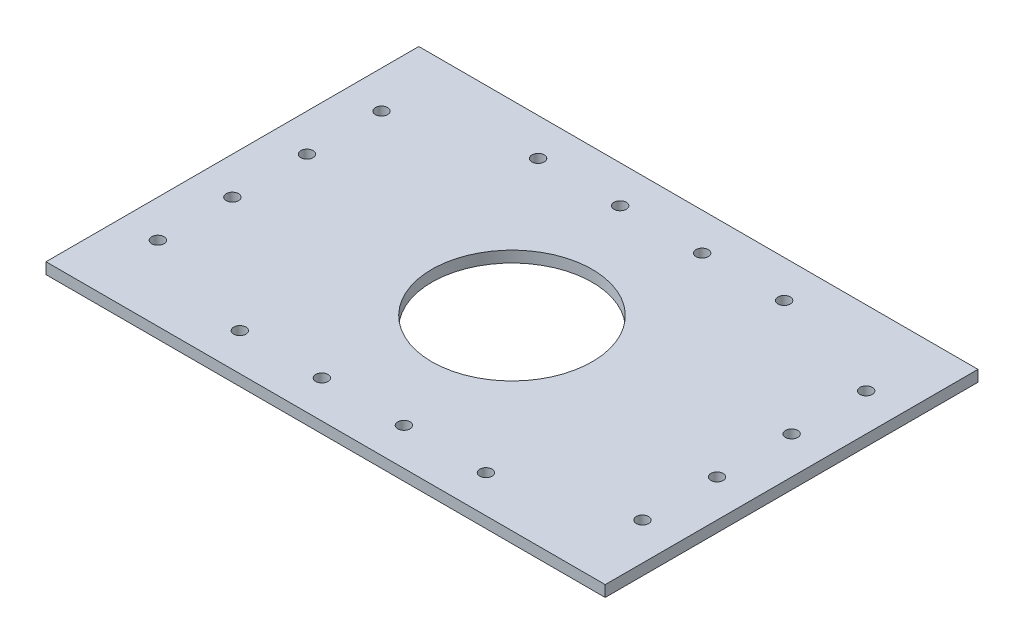
ISO-10303-21;
HEADER;
FILE_DESCRIPTION(('STEP AP214'),'2;1');
FILE_NAME('part.step','',(''),(''),'','','');
FILE_SCHEMA(('AUTOMOTIVE_DESIGN { 1 0 10303 214 1 1 1 1 }'));
ENDSEC;
DATA;
#1=APPLICATION_CONTEXT('core data for automotive mechanical design processes');
#2=APPLICATION_PROTOCOL_DEFINITION('international standard','automotive_design',2000,#1);
#3=PRODUCT_CONTEXT('',#1,'mechanical');
#4=PRODUCT('Part','Part','',(#3));
#5=PRODUCT_RELATED_PRODUCT_CATEGORY('part','',(#4));
#6=PRODUCT_DEFINITION_FORMATION('','',#4);
#7=PRODUCT_DEFINITION_CONTEXT('part definition',#1,'design');
#8=PRODUCT_DEFINITION('design','',#6,#7);
#9=PRODUCT_DEFINITION_SHAPE('','',#8);
#10=(LENGTH_UNIT() NAMED_UNIT(*) SI_UNIT(.MILLI.,.METRE.));
#11=(NAMED_UNIT(*) PLANE_ANGLE_UNIT() SI_UNIT($,.RADIAN.));
#12=(NAMED_UNIT(*) SI_UNIT($,.STERADIAN.) SOLID_ANGLE_UNIT());
#13=UNCERTAINTY_MEASURE_WITH_UNIT(LENGTH_MEASURE(1.E-05),#10,'distance_accuracy_value','');
#14=(GEOMETRIC_REPRESENTATION_CONTEXT(3) GLOBAL_UNCERTAINTY_ASSIGNED_CONTEXT((#13)) GLOBAL_UNIT_ASSIGNED_CONTEXT((#10,
#11,#12)) REPRESENTATION_CONTEXT('',''));
#15=CARTESIAN_POINT('',(0.,0.,0.));
#16=DIRECTION('',(0.,0.,1.));
#17=DIRECTION('',(1.,0.,0.));
#18=AXIS2_PLACEMENT_3D('',#15,#16,#17);
#19=CARTESIAN_POINT('',(0.,3.,0.));
#20=DIRECTION('',(0.,1.,0.));
#21=DIRECTION('',(0.,0.,1.));
#22=AXIS2_PLACEMENT_3D('',#19,#20,#21);
#23=PLANE('',#22);
#24=CARTESIAN_POINT('',(-11.,3.,40.));
#25=DIRECTION('',(0.,1.,0.));
#26=DIRECTION('',(0.,0.,-1.));
#27=AXIS2_PLACEMENT_3D('',#24,#25,#26);
#28=CIRCLE('',#27,1.65);
#29=CARTESIAN_POINT('',(-11.,3.,38.35));
#30=VERTEX_POINT('',#29);
#31=EDGE_CURVE('E207',#30,#30,#28,.T.);
#32=ORIENTED_EDGE('',*,*,#31,.F.);
#33=EDGE_LOOP('',(#32));
#34=FACE_BOUND('',#33,.T.);
#35=CARTESIAN_POINT('',(33.,3.,40.));
#36=DIRECTION('',(0.,1.,0.));
#37=DIRECTION('',(0.,0.,-1.));
#38=AXIS2_PLACEMENT_3D('',#35,#36,#37);
#39=CIRCLE('',#38,1.65);
#40=CARTESIAN_POINT('',(33.,3.,38.35));
#41=VERTEX_POINT('',#40);
#42=EDGE_CURVE('E195',#41,#41,#39,.T.);
#43=ORIENTED_EDGE('',*,*,#42,.F.);
#44=EDGE_LOOP('',(#43));
#45=FACE_BOUND('',#44,.T.);
#46=CARTESIAN_POINT('',(-11.,3.,-40.));
#47=DIRECTION('',(0.,1.,0.));
#48=DIRECTION('',(0.,0.,1.));
#49=AXIS2_PLACEMENT_3D('',#46,#47,#48);
#50=CIRCLE('',#49,1.65);
#51=CARTESIAN_POINT('',(-11.,3.,-38.35));
#52=VERTEX_POINT('',#51);
#53=EDGE_CURVE('E183',#52,#52,#50,.T.);
#54=ORIENTED_EDGE('',*,*,#53,.F.);
#55=EDGE_LOOP('',(#54));
#56=FACE_BOUND('',#55,.T.);
#57=CARTESIAN_POINT('',(33.,3.,-40.));
#58=DIRECTION('',(0.,1.,0.));
#59=DIRECTION('',(0.,0.,1.));
#60=AXIS2_PLACEMENT_3D('',#57,#58,#59);
#61=CIRCLE('',#60,1.65);
#62=CARTESIAN_POINT('',(33.,3.,-38.35));
#63=VERTEX_POINT('',#62);
#64=EDGE_CURVE('E171',#63,#63,#61,.T.);
#65=ORIENTED_EDGE('',*,*,#64,.F.);
#66=EDGE_LOOP('',(#65));
#67=FACE_BOUND('',#66,.T.);
#68=CARTESIAN_POINT('',(64.9999999999999,3.,-10.));
#69=DIRECTION('',(0.,1.,0.));
#70=DIRECTION('',(0.,0.,-1.));
#71=AXIS2_PLACEMENT_3D('',#68,#69,#70);
#72=CIRCLE('',#71,1.65);
#73=CARTESIAN_POINT('',(64.9999999999999,3.,-11.65));
#74=VERTEX_POINT('',#73);
#75=EDGE_CURVE('E159',#74,#74,#72,.T.);
#76=ORIENTED_EDGE('',*,*,#75,.F.);
#77=EDGE_LOOP('',(#76));
#78=FACE_BOUND('',#77,.T.);
#79=CARTESIAN_POINT('',(64.9999999999999,3.,30.));
#80=DIRECTION('',(0.,1.,0.));
#81=DIRECTION('',(0.,0.,-1.));
#82=AXIS2_PLACEMENT_3D('',#79,#80,#81);
#83=CIRCLE('',#82,1.65);
#84=CARTESIAN_POINT('',(64.9999999999999,3.,28.35));
#85=VERTEX_POINT('',#84);
#86=EDGE_CURVE('E147',#85,#85,#83,.T.);
#87=ORIENTED_EDGE('',*,*,#86,.F.);
#88=EDGE_LOOP('',(#87));
#89=FACE_BOUND('',#88,.T.);
#90=CARTESIAN_POINT('',(-65.,3.,9.99999999999999));
#91=DIRECTION('',(0.,1.,0.));
#92=DIRECTION('',(0.,0.,1.));
#93=AXIS2_PLACEMENT_3D('',#90,#91,#92);
#94=CIRCLE('',#93,1.65);
#95=CARTESIAN_POINT('',(-65.,3.,11.65));
#96=VERTEX_POINT('',#95);
#97=EDGE_CURVE('E135',#96,#96,#94,.T.);
#98=ORIENTED_EDGE('',*,*,#97,.F.);
#99=EDGE_LOOP('',(#98));
#100=FACE_BOUND('',#99,.T.);
#101=CARTESIAN_POINT('',(-65.,3.,-30.));
#102=DIRECTION('',(0.,1.,0.));
#103=DIRECTION('',(0.,0.,1.));
#104=AXIS2_PLACEMENT_3D('',#101,#102,#103);
#105=CIRCLE('',#104,1.65);
#106=CARTESIAN_POINT('',(-65.,3.,-28.35));
#107=VERTEX_POINT('',#106);
#108=EDGE_CURVE('E123',#107,#107,#105,.T.);
#109=ORIENTED_EDGE('',*,*,#108,.F.);
#110=EDGE_LOOP('',(#109));
#111=FACE_BOUND('',#110,.T.);
#112=DIRECTION('',(0.,0.,-1.));
#113=VECTOR('',#112,1.);
#114=CARTESIAN_POINT('',(75.,3.,-50.));
#115=LINE('',#114,#113);
#116=CARTESIAN_POINT('',(75.,3.,50.));
#117=VERTEX_POINT('',#116);
#118=CARTESIAN_POINT('',(75.,3.,-50.));
#119=VERTEX_POINT('',#118);
#120=EDGE_CURVE('E93',#117,#119,#115,.T.);
#121=ORIENTED_EDGE('',*,*,#120,.T.);
#122=DIRECTION('',(-1.,0.,0.));
#123=VECTOR('',#122,1.);
#124=CARTESIAN_POINT('',(-75.,3.,-50.));
#125=LINE('',#124,#123);
#126=CARTESIAN_POINT('',(-75.,3.,-50.));
#127=VERTEX_POINT('',#126);
#128=EDGE_CURVE('E88',#119,#127,#125,.T.);
#129=ORIENTED_EDGE('',*,*,#128,.T.);
#130=DIRECTION('',(0.,0.,1.));
#131=VECTOR('',#130,1.);
#132=CARTESIAN_POINT('',(-75.,3.,-50.));
#133=LINE('',#132,#131);
#134=CARTESIAN_POINT('',(-75.,3.,50.));
#135=VERTEX_POINT('',#134);
#136=EDGE_CURVE('E91',#127,#135,#133,.T.);
#137=ORIENTED_EDGE('',*,*,#136,.T.);
#138=DIRECTION('',(1.,0.,0.));
#139=VECTOR('',#138,1.);
#140=CARTESIAN_POINT('',(-75.,3.,50.));
#141=LINE('',#140,#139);
#142=EDGE_CURVE('E58',#135,#117,#141,.T.);
#143=ORIENTED_EDGE('',*,*,#142,.T.);
#144=EDGE_LOOP('',(#121,#129,#137,#143));
#145=FACE_BOUND('',#144,.T.);
#146=CARTESIAN_POINT('',(0.,3.,0.));
#147=DIRECTION('',(0.,1.,0.));
#148=DIRECTION('',(0.,0.,1.));
#149=AXIS2_PLACEMENT_3D('',#146,#147,#148);
#150=CIRCLE('',#149,21.5);
#151=CARTESIAN_POINT('',(0.,3.,21.5));
#152=VERTEX_POINT('',#151);
#153=EDGE_CURVE('E108',#152,#152,#150,.T.);
#154=ORIENTED_EDGE('',*,*,#153,.F.);
#155=EDGE_LOOP('',(#154));
#156=FACE_BOUND('',#155,.T.);
#157=CARTESIAN_POINT('',(-65.,3.,-10.));
#158=DIRECTION('',(0.,1.,0.));
#159=DIRECTION('',(0.,0.,1.));
#160=AXIS2_PLACEMENT_3D('',#157,#158,#159);
#161=CIRCLE('',#160,1.65);
#162=CARTESIAN_POINT('',(-65.,3.,-8.35000000000001));
#163=VERTEX_POINT('',#162);
#164=EDGE_CURVE('E129',#163,#163,#161,.T.);
#165=ORIENTED_EDGE('',*,*,#164,.F.);
#166=EDGE_LOOP('',(#165));
#167=FACE_BOUND('',#166,.T.);
#168=CARTESIAN_POINT('',(-65.,3.,30.));
#169=DIRECTION('',(0.,1.,0.));
#170=DIRECTION('',(0.,0.,1.));
#171=AXIS2_PLACEMENT_3D('',#168,#169,#170);
#172=CIRCLE('',#171,1.65);
#173=CARTESIAN_POINT('',(-65.,3.,31.65));
#174=VERTEX_POINT('',#173);
#175=EDGE_CURVE('E141',#174,#174,#172,.T.);
#176=ORIENTED_EDGE('',*,*,#175,.F.);
#177=EDGE_LOOP('',(#176));
#178=FACE_BOUND('',#177,.T.);
#179=CARTESIAN_POINT('',(64.9999999999999,3.,9.99999999999998));
#180=DIRECTION('',(0.,1.,0.));
#181=DIRECTION('',(0.,0.,-1.));
#182=AXIS2_PLACEMENT_3D('',#179,#180,#181);
#183=CIRCLE('',#182,1.65);
#184=CARTESIAN_POINT('',(64.9999999999999,3.,8.34999999999998));
#185=VERTEX_POINT('',#184);
#186=EDGE_CURVE('E153',#185,#185,#183,.T.);
#187=ORIENTED_EDGE('',*,*,#186,.F.);
#188=EDGE_LOOP('',(#187));
#189=FACE_BOUND('',#188,.T.);
#190=CARTESIAN_POINT('',(64.9999999999999,3.,-30.));
#191=DIRECTION('',(0.,1.,0.));
#192=DIRECTION('',(0.,0.,-1.));
#193=AXIS2_PLACEMENT_3D('',#190,#191,#192);
#194=CIRCLE('',#193,1.65);
#195=CARTESIAN_POINT('',(64.9999999999999,3.,-31.65));
#196=VERTEX_POINT('',#195);
#197=EDGE_CURVE('E165',#196,#196,#194,.T.);
#198=ORIENTED_EDGE('',*,*,#197,.F.);
#199=EDGE_LOOP('',(#198));
#200=FACE_BOUND('',#199,.T.);
#201=CARTESIAN_POINT('',(11.,3.,-40.));
#202=DIRECTION('',(0.,1.,0.));
#203=DIRECTION('',(0.,0.,1.));
#204=AXIS2_PLACEMENT_3D('',#201,#202,#203);
#205=CIRCLE('',#204,1.65);
#206=CARTESIAN_POINT('',(11.,3.,-38.35));
#207=VERTEX_POINT('',#206);
#208=EDGE_CURVE('E177',#207,#207,#205,.T.);
#209=ORIENTED_EDGE('',*,*,#208,.F.);
#210=EDGE_LOOP('',(#209));
#211=FACE_BOUND('',#210,.T.);
#212=CARTESIAN_POINT('',(-33.,3.,-40.));
#213=DIRECTION('',(0.,1.,0.));
#214=DIRECTION('',(0.,0.,1.));
#215=AXIS2_PLACEMENT_3D('',#212,#213,#214);
#216=CIRCLE('',#215,1.65);
#217=CARTESIAN_POINT('',(-33.,3.,-38.35));
#218=VERTEX_POINT('',#217);
#219=EDGE_CURVE('E189',#218,#218,#216,.T.);
#220=ORIENTED_EDGE('',*,*,#219,.F.);
#221=EDGE_LOOP('',(#220));
#222=FACE_BOUND('',#221,.T.);
#223=CARTESIAN_POINT('',(11.,3.,40.));
#224=DIRECTION('',(0.,1.,0.));
#225=DIRECTION('',(0.,0.,-1.));
#226=AXIS2_PLACEMENT_3D('',#223,#224,#225);
#227=CIRCLE('',#226,1.65);
#228=CARTESIAN_POINT('',(11.,3.,38.35));
#229=VERTEX_POINT('',#228);
#230=EDGE_CURVE('E201',#229,#229,#227,.T.);
#231=ORIENTED_EDGE('',*,*,#230,.F.);
#232=EDGE_LOOP('',(#231));
#233=FACE_BOUND('',#232,.T.);
#234=CARTESIAN_POINT('',(-33.,3.,40.));
#235=DIRECTION('',(0.,1.,0.));
#236=DIRECTION('',(0.,0.,-1.));
#237=AXIS2_PLACEMENT_3D('',#234,#235,#236);
#238=CIRCLE('',#237,1.65);
#239=CARTESIAN_POINT('',(-33.,3.,38.35));
#240=VERTEX_POINT('',#239);
#241=EDGE_CURVE('E213',#240,#240,#238,.T.);
#242=ORIENTED_EDGE('',*,*,#241,.F.);
#243=EDGE_LOOP('',(#242));
#244=FACE_BOUND('',#243,.T.);
#245=ADVANCED_FACE('F41',(#34,#45,#56,#67,#78,#89,#100,#111,#145,#156,#167,#178,#189,#200,#211,
#222,#233,#244),#23,.T.);
#246=CARTESIAN_POINT('',(0.,0.,0.));
#247=DIRECTION('',(0.,1.,0.));
#248=DIRECTION('',(0.,0.,1.));
#249=AXIS2_PLACEMENT_3D('',#246,#247,#248);
#250=PLANE('',#249);
#251=DIRECTION('',(0.,0.,-1.));
#252=VECTOR('',#251,1.);
#253=CARTESIAN_POINT('',(75.,0.,-50.));
#254=LINE('',#253,#252);
#255=CARTESIAN_POINT('',(75.,0.,50.));
#256=VERTEX_POINT('',#255);
#257=CARTESIAN_POINT('',(75.,0.,-50.));
#258=VERTEX_POINT('',#257);
#259=EDGE_CURVE('E105',#256,#258,#254,.T.);
#260=ORIENTED_EDGE('',*,*,#259,.F.);
#261=DIRECTION('',(1.,0.,0.));
#262=VECTOR('',#261,1.);
#263=CARTESIAN_POINT('',(-75.,0.,50.));
#264=LINE('',#263,#262);
#265=CARTESIAN_POINT('',(-75.,0.,50.));
#266=VERTEX_POINT('',#265);
#267=EDGE_CURVE('E81',#266,#256,#264,.T.);
#268=ORIENTED_EDGE('',*,*,#267,.F.);
#269=DIRECTION('',(0.,0.,1.));
#270=VECTOR('',#269,1.);
#271=CARTESIAN_POINT('',(-75.,0.,-50.));
#272=LINE('',#271,#270);
#273=CARTESIAN_POINT('',(-75.,0.,-50.));
#274=VERTEX_POINT('',#273);
#275=EDGE_CURVE('E75',#274,#266,#272,.T.);
#276=ORIENTED_EDGE('',*,*,#275,.F.);
#277=DIRECTION('',(-1.,0.,0.));
#278=VECTOR('',#277,1.);
#279=CARTESIAN_POINT('',(-75.,0.,-50.));
#280=LINE('',#279,#278);
#281=EDGE_CURVE('E97',#258,#274,#280,.T.);
#282=ORIENTED_EDGE('',*,*,#281,.F.);
#283=EDGE_LOOP('',(#260,#268,#276,#282));
#284=FACE_BOUND('',#283,.T.);
#285=CARTESIAN_POINT('',(0.,0.,0.));
#286=DIRECTION('',(0.,1.,0.));
#287=DIRECTION('',(0.,0.,1.));
#288=AXIS2_PLACEMENT_3D('',#285,#286,#287);
#289=CIRCLE('',#288,21.5);
#290=CARTESIAN_POINT('',(0.,0.,21.5));
#291=VERTEX_POINT('',#290);
#292=EDGE_CURVE('E120',#291,#291,#289,.T.);
#293=ORIENTED_EDGE('',*,*,#292,.T.);
#294=EDGE_LOOP('',(#293));
#295=FACE_BOUND('',#294,.T.);
#296=CARTESIAN_POINT('',(-65.,0.,-30.));
#297=DIRECTION('',(0.,1.,0.));
#298=DIRECTION('',(0.,0.,1.));
#299=AXIS2_PLACEMENT_3D('',#296,#297,#298);
#300=CIRCLE('',#299,1.65);
#301=CARTESIAN_POINT('',(-65.,0.,-28.35));
#302=VERTEX_POINT('',#301);
#303=EDGE_CURVE('E126',#302,#302,#300,.T.);
#304=ORIENTED_EDGE('',*,*,#303,.T.);
#305=EDGE_LOOP('',(#304));
#306=FACE_BOUND('',#305,.T.);
#307=CARTESIAN_POINT('',(-65.,0.,-10.));
#308=DIRECTION('',(0.,1.,0.));
#309=DIRECTION('',(0.,0.,1.));
#310=AXIS2_PLACEMENT_3D('',#307,#308,#309);
#311=CIRCLE('',#310,1.65);
#312=CARTESIAN_POINT('',(-65.,0.,-8.35000000000001));
#313=VERTEX_POINT('',#312);
#314=EDGE_CURVE('E132',#313,#313,#311,.T.);
#315=ORIENTED_EDGE('',*,*,#314,.T.);
#316=EDGE_LOOP('',(#315));
#317=FACE_BOUND('',#316,.T.);
#318=CARTESIAN_POINT('',(-65.,0.,9.99999999999999));
#319=DIRECTION('',(0.,1.,0.));
#320=DIRECTION('',(0.,0.,1.));
#321=AXIS2_PLACEMENT_3D('',#318,#319,#320);
#322=CIRCLE('',#321,1.65);
#323=CARTESIAN_POINT('',(-65.,0.,11.65));
#324=VERTEX_POINT('',#323);
#325=EDGE_CURVE('E138',#324,#324,#322,.T.);
#326=ORIENTED_EDGE('',*,*,#325,.T.);
#327=EDGE_LOOP('',(#326));
#328=FACE_BOUND('',#327,.T.);
#329=CARTESIAN_POINT('',(-65.,0.,30.));
#330=DIRECTION('',(0.,1.,0.));
#331=DIRECTION('',(0.,0.,1.));
#332=AXIS2_PLACEMENT_3D('',#329,#330,#331);
#333=CIRCLE('',#332,1.65);
#334=CARTESIAN_POINT('',(-65.,0.,31.65));
#335=VERTEX_POINT('',#334);
#336=EDGE_CURVE('E144',#335,#335,#333,.T.);
#337=ORIENTED_EDGE('',*,*,#336,.T.);
#338=EDGE_LOOP('',(#337));
#339=FACE_BOUND('',#338,.T.);
#340=CARTESIAN_POINT('',(64.9999999999999,0.,30.));
#341=DIRECTION('',(0.,1.,0.));
#342=DIRECTION('',(0.,0.,-1.));
#343=AXIS2_PLACEMENT_3D('',#340,#341,#342);
#344=CIRCLE('',#343,1.65);
#345=CARTESIAN_POINT('',(64.9999999999999,0.,28.35));
#346=VERTEX_POINT('',#345);
#347=EDGE_CURVE('E150',#346,#346,#344,.T.);
#348=ORIENTED_EDGE('',*,*,#347,.T.);
#349=EDGE_LOOP('',(#348));
#350=FACE_BOUND('',#349,.T.);
#351=CARTESIAN_POINT('',(64.9999999999999,0.,9.99999999999998));
#352=DIRECTION('',(0.,1.,0.));
#353=DIRECTION('',(0.,0.,-1.));
#354=AXIS2_PLACEMENT_3D('',#351,#352,#353);
#355=CIRCLE('',#354,1.65);
#356=CARTESIAN_POINT('',(64.9999999999999,0.,8.34999999999998));
#357=VERTEX_POINT('',#356);
#358=EDGE_CURVE('E156',#357,#357,#355,.T.);
#359=ORIENTED_EDGE('',*,*,#358,.T.);
#360=EDGE_LOOP('',(#359));
#361=FACE_BOUND('',#360,.T.);
#362=CARTESIAN_POINT('',(64.9999999999999,0.,-10.));
#363=DIRECTION('',(0.,1.,0.));
#364=DIRECTION('',(0.,0.,-1.));
#365=AXIS2_PLACEMENT_3D('',#362,#363,#364);
#366=CIRCLE('',#365,1.65);
#367=CARTESIAN_POINT('',(64.9999999999999,0.,-11.65));
#368=VERTEX_POINT('',#367);
#369=EDGE_CURVE('E162',#368,#368,#366,.T.);
#370=ORIENTED_EDGE('',*,*,#369,.T.);
#371=EDGE_LOOP('',(#370));
#372=FACE_BOUND('',#371,.T.);
#373=CARTESIAN_POINT('',(64.9999999999999,0.,-30.));
#374=DIRECTION('',(0.,1.,0.));
#375=DIRECTION('',(0.,0.,-1.));
#376=AXIS2_PLACEMENT_3D('',#373,#374,#375);
#377=CIRCLE('',#376,1.65);
#378=CARTESIAN_POINT('',(64.9999999999999,0.,-31.65));
#379=VERTEX_POINT('',#378);
#380=EDGE_CURVE('E168',#379,#379,#377,.T.);
#381=ORIENTED_EDGE('',*,*,#380,.T.);
#382=EDGE_LOOP('',(#381));
#383=FACE_BOUND('',#382,.T.);
#384=CARTESIAN_POINT('',(33.,0.,-40.));
#385=DIRECTION('',(0.,1.,0.));
#386=DIRECTION('',(0.,0.,1.));
#387=AXIS2_PLACEMENT_3D('',#384,#385,#386);
#388=CIRCLE('',#387,1.65);
#389=CARTESIAN_POINT('',(33.,0.,-38.35));
#390=VERTEX_POINT('',#389);
#391=EDGE_CURVE('E174',#390,#390,#388,.T.);
#392=ORIENTED_EDGE('',*,*,#391,.T.);
#393=EDGE_LOOP('',(#392));
#394=FACE_BOUND('',#393,.T.);
#395=CARTESIAN_POINT('',(11.,0.,-40.));
#396=DIRECTION('',(0.,1.,0.));
#397=DIRECTION('',(0.,0.,1.));
#398=AXIS2_PLACEMENT_3D('',#395,#396,#397);
#399=CIRCLE('',#398,1.65);
#400=CARTESIAN_POINT('',(11.,0.,-38.35));
#401=VERTEX_POINT('',#400);
#402=EDGE_CURVE('E180',#401,#401,#399,.T.);
#403=ORIENTED_EDGE('',*,*,#402,.T.);
#404=EDGE_LOOP('',(#403));
#405=FACE_BOUND('',#404,.T.);
#406=CARTESIAN_POINT('',(-11.,0.,-40.));
#407=DIRECTION('',(0.,1.,0.));
#408=DIRECTION('',(0.,0.,1.));
#409=AXIS2_PLACEMENT_3D('',#406,#407,#408);
#410=CIRCLE('',#409,1.65);
#411=CARTESIAN_POINT('',(-11.,0.,-38.35));
#412=VERTEX_POINT('',#411);
#413=EDGE_CURVE('E186',#412,#412,#410,.T.);
#414=ORIENTED_EDGE('',*,*,#413,.T.);
#415=EDGE_LOOP('',(#414));
#416=FACE_BOUND('',#415,.T.);
#417=CARTESIAN_POINT('',(-33.,0.,-40.));
#418=DIRECTION('',(0.,1.,0.));
#419=DIRECTION('',(0.,0.,1.));
#420=AXIS2_PLACEMENT_3D('',#417,#418,#419);
#421=CIRCLE('',#420,1.65);
#422=CARTESIAN_POINT('',(-33.,0.,-38.35));
#423=VERTEX_POINT('',#422);
#424=EDGE_CURVE('E192',#423,#423,#421,.T.);
#425=ORIENTED_EDGE('',*,*,#424,.T.);
#426=EDGE_LOOP('',(#425));
#427=FACE_BOUND('',#426,.T.);
#428=CARTESIAN_POINT('',(33.,0.,40.));
#429=DIRECTION('',(0.,1.,0.));
#430=DIRECTION('',(0.,0.,-1.));
#431=AXIS2_PLACEMENT_3D('',#428,#429,#430);
#432=CIRCLE('',#431,1.65);
#433=CARTESIAN_POINT('',(33.,0.,38.35));
#434=VERTEX_POINT('',#433);
#435=EDGE_CURVE('E198',#434,#434,#432,.T.);
#436=ORIENTED_EDGE('',*,*,#435,.T.);
#437=EDGE_LOOP('',(#436));
#438=FACE_BOUND('',#437,.T.);
#439=CARTESIAN_POINT('',(11.,0.,40.));
#440=DIRECTION('',(0.,1.,0.));
#441=DIRECTION('',(0.,0.,-1.));
#442=AXIS2_PLACEMENT_3D('',#439,#440,#441);
#443=CIRCLE('',#442,1.65);
#444=CARTESIAN_POINT('',(11.,0.,38.35));
#445=VERTEX_POINT('',#444);
#446=EDGE_CURVE('E204',#445,#445,#443,.T.);
#447=ORIENTED_EDGE('',*,*,#446,.T.);
#448=EDGE_LOOP('',(#447));
#449=FACE_BOUND('',#448,.T.);
#450=CARTESIAN_POINT('',(-11.,0.,40.));
#451=DIRECTION('',(0.,1.,0.));
#452=DIRECTION('',(0.,0.,-1.));
#453=AXIS2_PLACEMENT_3D('',#450,#451,#452);
#454=CIRCLE('',#453,1.65);
#455=CARTESIAN_POINT('',(-11.,0.,38.35));
#456=VERTEX_POINT('',#455);
#457=EDGE_CURVE('E210',#456,#456,#454,.T.);
#458=ORIENTED_EDGE('',*,*,#457,.T.);
#459=EDGE_LOOP('',(#458));
#460=FACE_BOUND('',#459,.T.);
#461=CARTESIAN_POINT('',(-33.,0.,40.));
#462=DIRECTION('',(0.,1.,0.));
#463=DIRECTION('',(0.,0.,-1.));
#464=AXIS2_PLACEMENT_3D('',#461,#462,#463);
#465=CIRCLE('',#464,1.65);
#466=CARTESIAN_POINT('',(-33.,0.,38.35));
#467=VERTEX_POINT('',#466);
#468=EDGE_CURVE('E216',#467,#467,#465,.T.);
#469=ORIENTED_EDGE('',*,*,#468,.T.);
#470=EDGE_LOOP('',(#469));
#471=FACE_BOUND('',#470,.T.);
#472=ADVANCED_FACE('F116',(#284,#295,#306,#317,#328,#339,#350,#361,#372,#383,#394,#405,#416,
#427,#438,#449,#460,#471),#250,.F.);
#473=CARTESIAN_POINT('',(75.,3.,-50.));
#474=DIRECTION('',(-1.,0.,0.));
#475=DIRECTION('',(0.,0.,1.));
#476=AXIS2_PLACEMENT_3D('',#473,#474,#475);
#477=PLANE('',#476);
#478=ORIENTED_EDGE('',*,*,#259,.T.);
#479=DIRECTION('',(0.,-1.,0.));
#480=VECTOR('',#479,1.);
#481=CARTESIAN_POINT('',(75.,3.,-50.));
#482=LINE('',#481,#480);
#483=EDGE_CURVE('E11',#119,#258,#482,.T.);
#484=ORIENTED_EDGE('',*,*,#483,.F.);
#485=ORIENTED_EDGE('',*,*,#120,.F.);
#486=DIRECTION('',(0.,-1.,0.));
#487=VECTOR('',#486,1.);
#488=CARTESIAN_POINT('',(75.,3.,50.));
#489=LINE('',#488,#487);
#490=EDGE_CURVE('E101',#117,#256,#489,.T.);
#491=ORIENTED_EDGE('',*,*,#490,.T.);
#492=EDGE_LOOP('',(#478,#484,#485,#491));
#493=FACE_BOUND('',#492,.T.);
#494=ADVANCED_FACE('F43',(#493),#477,.F.);
#495=CARTESIAN_POINT('',(-75.,3.,-50.));
#496=DIRECTION('',(0.,0.,1.));
#497=DIRECTION('',(1.,0.,0.));
#498=AXIS2_PLACEMENT_3D('',#495,#496,#497);
#499=PLANE('',#498);
#500=ORIENTED_EDGE('',*,*,#281,.T.);
#501=DIRECTION('',(0.,-1.,0.));
#502=VECTOR('',#501,1.);
#503=CARTESIAN_POINT('',(-75.,3.,-50.));
#504=LINE('',#503,#502);
#505=EDGE_CURVE('E50',#127,#274,#504,.T.);
#506=ORIENTED_EDGE('',*,*,#505,.F.);
#507=ORIENTED_EDGE('',*,*,#128,.F.);
#508=ORIENTED_EDGE('',*,*,#483,.T.);
#509=EDGE_LOOP('',(#500,#506,#507,#508));
#510=FACE_BOUND('',#509,.T.);
#511=ADVANCED_FACE('F96',(#510),#499,.F.);
#512=CARTESIAN_POINT('',(-75.,3.,-50.));
#513=DIRECTION('',(1.,0.,0.));
#514=DIRECTION('',(0.,0.,-1.));
#515=AXIS2_PLACEMENT_3D('',#512,#513,#514);
#516=PLANE('',#515);
#517=ORIENTED_EDGE('',*,*,#275,.T.);
#518=DIRECTION('',(0.,-1.,0.));
#519=VECTOR('',#518,1.);
#520=CARTESIAN_POINT('',(-75.,3.,50.));
#521=LINE('',#520,#519);
#522=EDGE_CURVE('E98',#135,#266,#521,.T.);
#523=ORIENTED_EDGE('',*,*,#522,.F.);
#524=ORIENTED_EDGE('',*,*,#136,.F.);
#525=ORIENTED_EDGE('',*,*,#505,.T.);
#526=EDGE_LOOP('',(#517,#523,#524,#525));
#527=FACE_BOUND('',#526,.T.);
#528=ADVANCED_FACE('F99',(#527),#516,.F.);
#529=CARTESIAN_POINT('',(-75.,3.,50.));
#530=DIRECTION('',(0.,0.,-1.));
#531=DIRECTION('',(-1.,0.,0.));
#532=AXIS2_PLACEMENT_3D('',#529,#530,#531);
#533=PLANE('',#532);
#534=ORIENTED_EDGE('',*,*,#267,.T.);
#535=ORIENTED_EDGE('',*,*,#490,.F.);
#536=ORIENTED_EDGE('',*,*,#142,.F.);
#537=ORIENTED_EDGE('',*,*,#522,.T.);
#538=EDGE_LOOP('',(#534,#535,#536,#537));
#539=FACE_BOUND('',#538,.T.);
#540=ADVANCED_FACE('F113',(#539),#533,.F.);
#541=CARTESIAN_POINT('',(0.,3.,0.));
#542=DIRECTION('',(0.,-1.,0.));
#543=DIRECTION('',(0.,0.,-1.));
#544=AXIS2_PLACEMENT_3D('',#541,#542,#543);
#545=CYLINDRICAL_SURFACE('',#544,21.5);
#546=ORIENTED_EDGE('',*,*,#153,.T.);
#547=EDGE_LOOP('',(#546));
#548=FACE_BOUND('',#547,.T.);
#549=ORIENTED_EDGE('',*,*,#292,.F.);
#550=EDGE_LOOP('',(#549));
#551=FACE_BOUND('',#550,.T.);
#552=ADVANCED_FACE('F235',(#548,#551),#545,.F.);
#553=CARTESIAN_POINT('',(-65.,3.,-30.));
#554=DIRECTION('',(0.,-1.,0.));
#555=DIRECTION('',(0.,0.,-1.));
#556=AXIS2_PLACEMENT_3D('',#553,#554,#555);
#557=CYLINDRICAL_SURFACE('',#556,1.65);
#558=ORIENTED_EDGE('',*,*,#108,.T.);
#559=EDGE_LOOP('',(#558));
#560=FACE_BOUND('',#559,.T.);
#561=ORIENTED_EDGE('',*,*,#303,.F.);
#562=EDGE_LOOP('',(#561));
#563=FACE_BOUND('',#562,.T.);
#564=ADVANCED_FACE('F280',(#560,#563),#557,.F.);
#565=CARTESIAN_POINT('',(-65.,3.,-10.));
#566=DIRECTION('',(0.,-1.,0.));
#567=DIRECTION('',(0.,0.,-1.));
#568=AXIS2_PLACEMENT_3D('',#565,#566,#567);
#569=CYLINDRICAL_SURFACE('',#568,1.65);
#570=ORIENTED_EDGE('',*,*,#164,.T.);
#571=EDGE_LOOP('',(#570));
#572=FACE_BOUND('',#571,.T.);
#573=ORIENTED_EDGE('',*,*,#314,.F.);
#574=EDGE_LOOP('',(#573));
#575=FACE_BOUND('',#574,.T.);
#576=ADVANCED_FACE('F288',(#572,#575),#569,.F.);
#577=CARTESIAN_POINT('',(-65.,3.,9.99999999999999));
#578=DIRECTION('',(0.,-1.,0.));
#579=DIRECTION('',(0.,0.,-1.));
#580=AXIS2_PLACEMENT_3D('',#577,#578,#579);
#581=CYLINDRICAL_SURFACE('',#580,1.65);
#582=ORIENTED_EDGE('',*,*,#97,.T.);
#583=EDGE_LOOP('',(#582));
#584=FACE_BOUND('',#583,.T.);
#585=ORIENTED_EDGE('',*,*,#325,.F.);
#586=EDGE_LOOP('',(#585));
#587=FACE_BOUND('',#586,.T.);
#588=ADVANCED_FACE('F296',(#584,#587),#581,.F.);
#589=CARTESIAN_POINT('',(-65.,3.,30.));
#590=DIRECTION('',(0.,-1.,0.));
#591=DIRECTION('',(0.,0.,-1.));
#592=AXIS2_PLACEMENT_3D('',#589,#590,#591);
#593=CYLINDRICAL_SURFACE('',#592,1.65);
#594=ORIENTED_EDGE('',*,*,#175,.T.);
#595=EDGE_LOOP('',(#594));
#596=FACE_BOUND('',#595,.T.);
#597=ORIENTED_EDGE('',*,*,#336,.F.);
#598=EDGE_LOOP('',(#597));
#599=FACE_BOUND('',#598,.T.);
#600=ADVANCED_FACE('F305',(#596,#599),#593,.F.);
#601=CARTESIAN_POINT('',(64.9999999999999,3.,30.));
#602=DIRECTION('',(0.,-1.,0.));
#603=DIRECTION('',(0.,0.,-1.));
#604=AXIS2_PLACEMENT_3D('',#601,#602,#603);
#605=CYLINDRICAL_SURFACE('',#604,1.65);
#606=ORIENTED_EDGE('',*,*,#86,.T.);
#607=EDGE_LOOP('',(#606));
#608=FACE_BOUND('',#607,.T.);
#609=ORIENTED_EDGE('',*,*,#347,.F.);
#610=EDGE_LOOP('',(#609));
#611=FACE_BOUND('',#610,.T.);
#612=ADVANCED_FACE('F314',(#608,#611),#605,.F.);
#613=CARTESIAN_POINT('',(64.9999999999999,3.,9.99999999999998));
#614=DIRECTION('',(0.,-1.,0.));
#615=DIRECTION('',(0.,0.,-1.));
#616=AXIS2_PLACEMENT_3D('',#613,#614,#615);
#617=CYLINDRICAL_SURFACE('',#616,1.65);
#618=ORIENTED_EDGE('',*,*,#186,.T.);
#619=EDGE_LOOP('',(#618));
#620=FACE_BOUND('',#619,.T.);
#621=ORIENTED_EDGE('',*,*,#358,.F.);
#622=EDGE_LOOP('',(#621));
#623=FACE_BOUND('',#622,.T.);
#624=ADVANCED_FACE('F323',(#620,#623),#617,.F.);
#625=CARTESIAN_POINT('',(64.9999999999999,3.,-10.));
#626=DIRECTION('',(0.,-1.,0.));
#627=DIRECTION('',(0.,0.,-1.));
#628=AXIS2_PLACEMENT_3D('',#625,#626,#627);
#629=CYLINDRICAL_SURFACE('',#628,1.65);
#630=ORIENTED_EDGE('',*,*,#75,.T.);
#631=EDGE_LOOP('',(#630));
#632=FACE_BOUND('',#631,.T.);
#633=ORIENTED_EDGE('',*,*,#369,.F.);
#634=EDGE_LOOP('',(#633));
#635=FACE_BOUND('',#634,.T.);
#636=ADVANCED_FACE('F332',(#632,#635),#629,.F.);
#637=CARTESIAN_POINT('',(64.9999999999999,3.,-30.));
#638=DIRECTION('',(0.,-1.,0.));
#639=DIRECTION('',(0.,0.,-1.));
#640=AXIS2_PLACEMENT_3D('',#637,#638,#639);
#641=CYLINDRICAL_SURFACE('',#640,1.65);
#642=ORIENTED_EDGE('',*,*,#197,.T.);
#643=EDGE_LOOP('',(#642));
#644=FACE_BOUND('',#643,.T.);
#645=ORIENTED_EDGE('',*,*,#380,.F.);
#646=EDGE_LOOP('',(#645));
#647=FACE_BOUND('',#646,.T.);
#648=ADVANCED_FACE('F341',(#644,#647),#641,.F.);
#649=CARTESIAN_POINT('',(33.,3.,-40.));
#650=DIRECTION('',(0.,-1.,0.));
#651=DIRECTION('',(0.,0.,-1.));
#652=AXIS2_PLACEMENT_3D('',#649,#650,#651);
#653=CYLINDRICAL_SURFACE('',#652,1.65);
#654=ORIENTED_EDGE('',*,*,#64,.T.);
#655=EDGE_LOOP('',(#654));
#656=FACE_BOUND('',#655,.T.);
#657=ORIENTED_EDGE('',*,*,#391,.F.);
#658=EDGE_LOOP('',(#657));
#659=FACE_BOUND('',#658,.T.);
#660=ADVANCED_FACE('F350',(#656,#659),#653,.F.);
#661=CARTESIAN_POINT('',(11.,3.,-40.));
#662=DIRECTION('',(0.,-1.,0.));
#663=DIRECTION('',(0.,0.,-1.));
#664=AXIS2_PLACEMENT_3D('',#661,#662,#663);
#665=CYLINDRICAL_SURFACE('',#664,1.65);
#666=ORIENTED_EDGE('',*,*,#208,.T.);
#667=EDGE_LOOP('',(#666));
#668=FACE_BOUND('',#667,.T.);
#669=ORIENTED_EDGE('',*,*,#402,.F.);
#670=EDGE_LOOP('',(#669));
#671=FACE_BOUND('',#670,.T.);
#672=ADVANCED_FACE('F359',(#668,#671),#665,.F.);
#673=CARTESIAN_POINT('',(-11.,3.,-40.));
#674=DIRECTION('',(0.,-1.,0.));
#675=DIRECTION('',(0.,0.,-1.));
#676=AXIS2_PLACEMENT_3D('',#673,#674,#675);
#677=CYLINDRICAL_SURFACE('',#676,1.65);
#678=ORIENTED_EDGE('',*,*,#53,.T.);
#679=EDGE_LOOP('',(#678));
#680=FACE_BOUND('',#679,.T.);
#681=ORIENTED_EDGE('',*,*,#413,.F.);
#682=EDGE_LOOP('',(#681));
#683=FACE_BOUND('',#682,.T.);
#684=ADVANCED_FACE('F368',(#680,#683),#677,.F.);
#685=CARTESIAN_POINT('',(-33.,3.,-40.));
#686=DIRECTION('',(0.,-1.,0.));
#687=DIRECTION('',(0.,0.,-1.));
#688=AXIS2_PLACEMENT_3D('',#685,#686,#687);
#689=CYLINDRICAL_SURFACE('',#688,1.65);
#690=ORIENTED_EDGE('',*,*,#219,.T.);
#691=EDGE_LOOP('',(#690));
#692=FACE_BOUND('',#691,.T.);
#693=ORIENTED_EDGE('',*,*,#424,.F.);
#694=EDGE_LOOP('',(#693));
#695=FACE_BOUND('',#694,.T.);
#696=ADVANCED_FACE('F377',(#692,#695),#689,.F.);
#697=CARTESIAN_POINT('',(33.,3.,40.));
#698=DIRECTION('',(0.,-1.,0.));
#699=DIRECTION('',(0.,0.,-1.));
#700=AXIS2_PLACEMENT_3D('',#697,#698,#699);
#701=CYLINDRICAL_SURFACE('',#700,1.65);
#702=ORIENTED_EDGE('',*,*,#42,.T.);
#703=EDGE_LOOP('',(#702));
#704=FACE_BOUND('',#703,.T.);
#705=ORIENTED_EDGE('',*,*,#435,.F.);
#706=EDGE_LOOP('',(#705));
#707=FACE_BOUND('',#706,.T.);
#708=ADVANCED_FACE('F386',(#704,#707),#701,.F.);
#709=CARTESIAN_POINT('',(11.,3.,40.));
#710=DIRECTION('',(0.,-1.,0.));
#711=DIRECTION('',(0.,0.,-1.));
#712=AXIS2_PLACEMENT_3D('',#709,#710,#711);
#713=CYLINDRICAL_SURFACE('',#712,1.65);
#714=ORIENTED_EDGE('',*,*,#230,.T.);
#715=EDGE_LOOP('',(#714));
#716=FACE_BOUND('',#715,.T.);
#717=ORIENTED_EDGE('',*,*,#446,.F.);
#718=EDGE_LOOP('',(#717));
#719=FACE_BOUND('',#718,.T.);
#720=ADVANCED_FACE('F395',(#716,#719),#713,.F.);
#721=CARTESIAN_POINT('',(-11.,3.,40.));
#722=DIRECTION('',(0.,-1.,0.));
#723=DIRECTION('',(0.,0.,-1.));
#724=AXIS2_PLACEMENT_3D('',#721,#722,#723);
#725=CYLINDRICAL_SURFACE('',#724,1.65);
#726=ORIENTED_EDGE('',*,*,#31,.T.);
#727=EDGE_LOOP('',(#726));
#728=FACE_BOUND('',#727,.T.);
#729=ORIENTED_EDGE('',*,*,#457,.F.);
#730=EDGE_LOOP('',(#729));
#731=FACE_BOUND('',#730,.T.);
#732=ADVANCED_FACE('F404',(#728,#731),#725,.F.);
#733=CARTESIAN_POINT('',(-33.,3.,40.));
#734=DIRECTION('',(0.,-1.,0.));
#735=DIRECTION('',(0.,0.,-1.));
#736=AXIS2_PLACEMENT_3D('',#733,#734,#735);
#737=CYLINDRICAL_SURFACE('',#736,1.65);
#738=ORIENTED_EDGE('',*,*,#241,.T.);
#739=EDGE_LOOP('',(#738));
#740=FACE_BOUND('',#739,.T.);
#741=ORIENTED_EDGE('',*,*,#468,.F.);
#742=EDGE_LOOP('',(#741));
#743=FACE_BOUND('',#742,.T.);
#744=ADVANCED_FACE('F222',(#740,#743),#737,.F.);
#745=CLOSED_SHELL('',(#245,#472,#494,#511,#528,#540,#552,#564,#576,#588,#600,#612,#624,#636,
#648,#660,#672,#684,#696,#708,#720,#732,#744));
#746=MANIFOLD_SOLID_BREP('B2',#745);
#747=ADVANCED_BREP_SHAPE_REPRESENTATION('',(#18,#746),#14);
#748=SHAPE_DEFINITION_REPRESENTATION(#9,#747);
ENDSEC;
END-ISO-10303-21;
